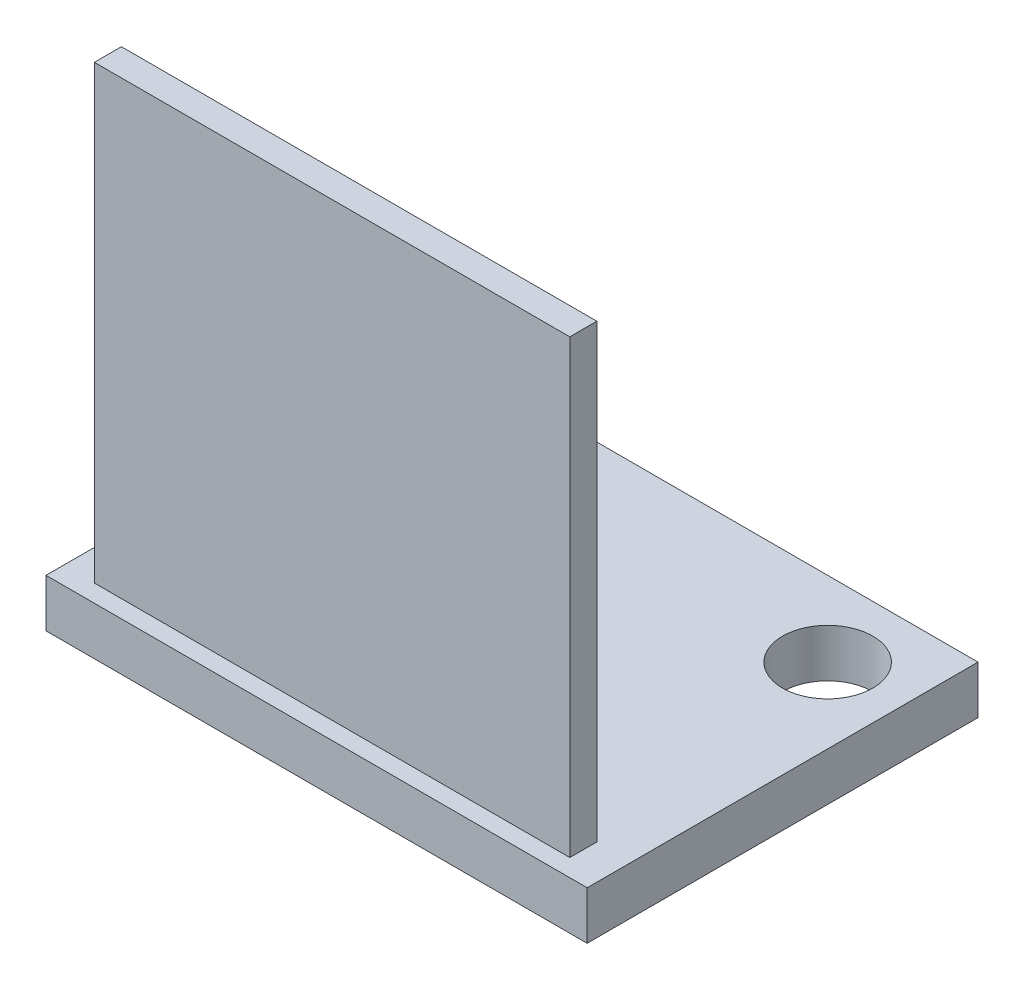
ISO-10303-21;
HEADER;
FILE_DESCRIPTION(('STEP AP214'),'2;1');
FILE_NAME('part.step','',(''),(''),'','','');
FILE_SCHEMA(('AUTOMOTIVE_DESIGN { 1 0 10303 214 1 1 1 1 }'));
ENDSEC;
DATA;
#1=APPLICATION_CONTEXT('core data for automotive mechanical design processes');
#2=APPLICATION_PROTOCOL_DEFINITION('international standard','automotive_design',2000,#1);
#3=PRODUCT_CONTEXT('',#1,'mechanical');
#4=PRODUCT('Part','Part','',(#3));
#5=PRODUCT_RELATED_PRODUCT_CATEGORY('part','',(#4));
#6=PRODUCT_DEFINITION_FORMATION('','',#4);
#7=PRODUCT_DEFINITION_CONTEXT('part definition',#1,'design');
#8=PRODUCT_DEFINITION('design','',#6,#7);
#9=PRODUCT_DEFINITION_SHAPE('','',#8);
#10=(LENGTH_UNIT() NAMED_UNIT(*) SI_UNIT(.MILLI.,.METRE.));
#11=(NAMED_UNIT(*) PLANE_ANGLE_UNIT() SI_UNIT($,.RADIAN.));
#12=(NAMED_UNIT(*) SI_UNIT($,.STERADIAN.) SOLID_ANGLE_UNIT());
#13=UNCERTAINTY_MEASURE_WITH_UNIT(LENGTH_MEASURE(1.E-05),#10,'distance_accuracy_value','');
#14=(GEOMETRIC_REPRESENTATION_CONTEXT(3) GLOBAL_UNCERTAINTY_ASSIGNED_CONTEXT((#13)) GLOBAL_UNIT_ASSIGNED_CONTEXT((#10,
#11,#12)) REPRESENTATION_CONTEXT('',''));
#15=CARTESIAN_POINT('',(0.,0.,0.));
#16=DIRECTION('',(0.,0.,1.));
#17=DIRECTION('',(1.,0.,0.));
#18=AXIS2_PLACEMENT_3D('',#15,#16,#17);
#19=CARTESIAN_POINT('',(0.,1.6,0.));
#20=DIRECTION('',(0.,1.,0.));
#21=DIRECTION('',(0.,0.,1.));
#22=AXIS2_PLACEMENT_3D('',#19,#20,#21);
#23=PLANE('',#22);
#24=CARTESIAN_POINT('',(2.5,1.6,2.5));
#25=DIRECTION('',(0.,1.,0.));
#26=DIRECTION('',(0.,0.,1.));
#27=AXIS2_PLACEMENT_3D('',#24,#25,#26);
#28=CIRCLE('',#27,1.5);
#29=CARTESIAN_POINT('',(2.5,1.6,4.));
#30=VERTEX_POINT('',#29);
#31=EDGE_CURVE('E190',#30,#30,#28,.T.);
#32=ORIENTED_EDGE('',*,*,#31,.F.);
#33=EDGE_LOOP('',(#32));
#34=FACE_BOUND('',#33,.T.);
#35=DIRECTION('',(0.,0.,1.));
#36=VECTOR('',#35,1.);
#37=CARTESIAN_POINT('',(0.,1.6,0.));
#38=LINE('',#37,#36);
#39=CARTESIAN_POINT('',(0.,1.6,0.));
#40=VERTEX_POINT('',#39);
#41=CARTESIAN_POINT('',(0.,1.6,13.));
#42=VERTEX_POINT('',#41);
#43=EDGE_CURVE('E196',#40,#42,#38,.T.);
#44=ORIENTED_EDGE('',*,*,#43,.T.);
#45=DIRECTION('',(1.,0.,0.));
#46=VECTOR('',#45,1.);
#47=CARTESIAN_POINT('',(0.,1.6,13.));
#48=LINE('',#47,#46);
#49=CARTESIAN_POINT('',(18.,1.6,13.));
#50=VERTEX_POINT('',#49);
#51=EDGE_CURVE('E199',#42,#50,#48,.T.);
#52=ORIENTED_EDGE('',*,*,#51,.T.);
#53=DIRECTION('',(0.,0.,-1.));
#54=VECTOR('',#53,1.);
#55=CARTESIAN_POINT('',(18.,1.6,0.));
#56=LINE('',#55,#54);
#57=CARTESIAN_POINT('',(18.,1.6,0.));
#58=VERTEX_POINT('',#57);
#59=EDGE_CURVE('E202',#50,#58,#56,.T.);
#60=ORIENTED_EDGE('',*,*,#59,.T.);
#61=DIRECTION('',(-1.,0.,0.));
#62=VECTOR('',#61,1.);
#63=CARTESIAN_POINT('',(0.,1.6,0.));
#64=LINE('',#63,#62);
#65=EDGE_CURVE('E204',#58,#40,#64,.T.);
#66=ORIENTED_EDGE('',*,*,#65,.T.);
#67=EDGE_LOOP('',(#44,#52,#60,#66));
#68=FACE_BOUND('',#67,.T.);
#69=CARTESIAN_POINT('',(15.5,1.6,2.5));
#70=DIRECTION('',(0.,1.,0.));
#71=DIRECTION('',(0.,0.,1.));
#72=AXIS2_PLACEMENT_3D('',#69,#70,#71);
#73=CIRCLE('',#72,1.5);
#74=CARTESIAN_POINT('',(15.5,1.6,3.99999999999999));
#75=VERTEX_POINT('',#74);
#76=EDGE_CURVE('E184',#75,#75,#73,.T.);
#77=ORIENTED_EDGE('',*,*,#76,.F.);
#78=EDGE_LOOP('',(#77));
#79=FACE_BOUND('',#78,.T.);
#80=DIRECTION('',(1.,0.,0.));
#81=VECTOR('',#80,1.);
#82=CARTESIAN_POINT('',(1.02633327182702,1.6,12.4178257241451));
#83=LINE('',#82,#81);
#84=CARTESIAN_POINT('',(1.02633327182702,1.6,12.4178257241451));
#85=VERTEX_POINT('',#84);
#86=CARTESIAN_POINT('',(16.8404948412724,1.6,12.4178257241451));
#87=VERTEX_POINT('',#86);
#88=EDGE_CURVE('E413',#85,#87,#83,.T.);
#89=ORIENTED_EDGE('',*,*,#88,.F.);
#90=DIRECTION('',(0.,0.,1.));
#91=VECTOR('',#90,1.);
#92=CARTESIAN_POINT('',(1.02633327182702,1.6,11.5189154875661));
#93=LINE('',#92,#91);
#94=CARTESIAN_POINT('',(1.02633327182702,1.6,11.5189154875661));
#95=VERTEX_POINT('',#94);
#96=EDGE_CURVE('E147',#95,#85,#93,.T.);
#97=ORIENTED_EDGE('',*,*,#96,.F.);
#98=DIRECTION('',(-1.,0.,0.));
#99=VECTOR('',#98,1.);
#100=CARTESIAN_POINT('',(1.02633327182702,1.6,11.5189154875661));
#101=LINE('',#100,#99);
#102=CARTESIAN_POINT('',(16.8404948412724,1.6,11.5189154875661));
#103=VERTEX_POINT('',#102);
#104=EDGE_CURVE('E143',#103,#95,#101,.T.);
#105=ORIENTED_EDGE('',*,*,#104,.F.);
#106=DIRECTION('',(0.,0.,-1.));
#107=VECTOR('',#106,1.);
#108=CARTESIAN_POINT('',(16.8404948412724,1.6,11.5189154875661));
#109=LINE('',#108,#107);
#110=EDGE_CURVE('E410',#87,#103,#109,.T.);
#111=ORIENTED_EDGE('',*,*,#110,.F.);
#112=EDGE_LOOP('',(#89,#97,#105,#111));
#113=FACE_BOUND('',#112,.T.);
#114=ADVANCED_FACE('F35',(#34,#68,#79,#113),#23,.T.);
#115=CARTESIAN_POINT('',(0.,0.,0.));
#116=DIRECTION('',(0.,1.,0.));
#117=DIRECTION('',(0.,0.,1.));
#118=AXIS2_PLACEMENT_3D('',#115,#116,#117);
#119=PLANE('',#118);
#120=CARTESIAN_POINT('',(15.5,0.,2.5));
#121=DIRECTION('',(0.,1.,0.));
#122=DIRECTION('',(0.,0.,1.));
#123=AXIS2_PLACEMENT_3D('',#120,#121,#122);
#124=CIRCLE('',#123,1.5);
#125=CARTESIAN_POINT('',(15.5,0.,3.99999999999999));
#126=VERTEX_POINT('',#125);
#127=EDGE_CURVE('E183',#126,#126,#124,.T.);
#128=ORIENTED_EDGE('',*,*,#127,.T.);
#129=EDGE_LOOP('',(#128));
#130=FACE_BOUND('',#129,.T.);
#131=CARTESIAN_POINT('',(2.5,0.,2.5));
#132=DIRECTION('',(0.,1.,0.));
#133=DIRECTION('',(0.,0.,1.));
#134=AXIS2_PLACEMENT_3D('',#131,#132,#133);
#135=CIRCLE('',#134,1.5);
#136=CARTESIAN_POINT('',(2.5,0.,4.));
#137=VERTEX_POINT('',#136);
#138=EDGE_CURVE('E187',#137,#137,#135,.T.);
#139=ORIENTED_EDGE('',*,*,#138,.T.);
#140=EDGE_LOOP('',(#139));
#141=FACE_BOUND('',#140,.T.);
#142=DIRECTION('',(0.,0.,1.));
#143=VECTOR('',#142,1.);
#144=CARTESIAN_POINT('',(0.,0.,0.));
#145=LINE('',#144,#143);
#146=CARTESIAN_POINT('',(0.,0.,0.));
#147=VERTEX_POINT('',#146);
#148=CARTESIAN_POINT('',(0.,0.,13.));
#149=VERTEX_POINT('',#148);
#150=EDGE_CURVE('E193',#147,#149,#145,.T.);
#151=ORIENTED_EDGE('',*,*,#150,.F.);
#152=DIRECTION('',(-1.,0.,0.));
#153=VECTOR('',#152,1.);
#154=CARTESIAN_POINT('',(0.,0.,0.));
#155=LINE('',#154,#153);
#156=CARTESIAN_POINT('',(18.,0.,0.));
#157=VERTEX_POINT('',#156);
#158=EDGE_CURVE('E200',#157,#147,#155,.T.);
#159=ORIENTED_EDGE('',*,*,#158,.F.);
#160=DIRECTION('',(0.,0.,-1.));
#161=VECTOR('',#160,1.);
#162=CARTESIAN_POINT('',(18.,0.,0.));
#163=LINE('',#162,#161);
#164=CARTESIAN_POINT('',(18.,0.,13.));
#165=VERTEX_POINT('',#164);
#166=EDGE_CURVE('E211',#165,#157,#163,.T.);
#167=ORIENTED_EDGE('',*,*,#166,.F.);
#168=DIRECTION('',(1.,0.,0.));
#169=VECTOR('',#168,1.);
#170=CARTESIAN_POINT('',(0.,0.,13.));
#171=LINE('',#170,#169);
#172=EDGE_CURVE('E209',#149,#165,#171,.T.);
#173=ORIENTED_EDGE('',*,*,#172,.F.);
#174=EDGE_LOOP('',(#151,#159,#167,#173));
#175=FACE_BOUND('',#174,.T.);
#176=DIRECTION('',(0.,0.,-1.));
#177=VECTOR('',#176,1.);
#178=CARTESIAN_POINT('',(1.5,0.,12.));
#179=LINE('',#178,#177);
#180=CARTESIAN_POINT('',(1.5,0.,12.));
#181=VERTEX_POINT('',#180);
#182=CARTESIAN_POINT('',(1.5,0.,10.5));
#183=VERTEX_POINT('',#182);
#184=EDGE_CURVE('E149',#181,#183,#179,.T.);
#185=ORIENTED_EDGE('',*,*,#184,.F.);
#186=DIRECTION('',(-1.,0.,0.));
#187=VECTOR('',#186,1.);
#188=CARTESIAN_POINT('',(1.5,0.,12.));
#189=LINE('',#188,#187);
#190=CARTESIAN_POINT('',(16.5,0.,12.));
#191=VERTEX_POINT('',#190);
#192=EDGE_CURVE('E160',#191,#181,#189,.T.);
#193=ORIENTED_EDGE('',*,*,#192,.F.);
#194=DIRECTION('',(0.,0.,1.));
#195=VECTOR('',#194,1.);
#196=CARTESIAN_POINT('',(16.5,0.,12.));
#197=LINE('',#196,#195);
#198=CARTESIAN_POINT('',(16.5,0.,10.5));
#199=VERTEX_POINT('',#198);
#200=EDGE_CURVE('E168',#199,#191,#197,.T.);
#201=ORIENTED_EDGE('',*,*,#200,.F.);
#202=DIRECTION('',(1.,0.,0.));
#203=VECTOR('',#202,1.);
#204=CARTESIAN_POINT('',(1.5,0.,10.5));
#205=LINE('',#204,#203);
#206=EDGE_CURVE('E58',#183,#199,#205,.T.);
#207=ORIENTED_EDGE('',*,*,#206,.F.);
#208=EDGE_LOOP('',(#185,#193,#201,#207));
#209=FACE_BOUND('',#208,.T.);
#210=ADVANCED_FACE('F229',(#130,#141,#175,#209),#119,.F.);
#211=CARTESIAN_POINT('',(0.,1.6,0.));
#212=DIRECTION('',(1.,0.,0.));
#213=DIRECTION('',(0.,0.,-1.));
#214=AXIS2_PLACEMENT_3D('',#211,#212,#213);
#215=PLANE('',#214);
#216=ORIENTED_EDGE('',*,*,#150,.T.);
#217=DIRECTION('',(0.,-1.,0.));
#218=VECTOR('',#217,1.);
#219=CARTESIAN_POINT('',(0.,1.6,13.));
#220=LINE('',#219,#218);
#221=EDGE_CURVE('E11',#42,#149,#220,.T.);
#222=ORIENTED_EDGE('',*,*,#221,.F.);
#223=ORIENTED_EDGE('',*,*,#43,.F.);
#224=DIRECTION('',(0.,-1.,0.));
#225=VECTOR('',#224,1.);
#226=CARTESIAN_POINT('',(0.,1.6,0.));
#227=LINE('',#226,#225);
#228=EDGE_CURVE('E206',#40,#147,#227,.T.);
#229=ORIENTED_EDGE('',*,*,#228,.T.);
#230=EDGE_LOOP('',(#216,#222,#223,#229));
#231=FACE_BOUND('',#230,.T.);
#232=ADVANCED_FACE('F37',(#231),#215,.F.);
#233=CARTESIAN_POINT('',(0.,1.6,13.));
#234=DIRECTION('',(0.,0.,-1.));
#235=DIRECTION('',(-1.,0.,0.));
#236=AXIS2_PLACEMENT_3D('',#233,#234,#235);
#237=PLANE('',#236);
#238=ORIENTED_EDGE('',*,*,#172,.T.);
#239=DIRECTION('',(0.,-1.,0.));
#240=VECTOR('',#239,1.);
#241=CARTESIAN_POINT('',(18.,1.6,13.));
#242=LINE('',#241,#240);
#243=EDGE_CURVE('E43',#50,#165,#242,.T.);
#244=ORIENTED_EDGE('',*,*,#243,.F.);
#245=ORIENTED_EDGE('',*,*,#51,.F.);
#246=ORIENTED_EDGE('',*,*,#221,.T.);
#247=EDGE_LOOP('',(#238,#244,#245,#246));
#248=FACE_BOUND('',#247,.T.);
#249=ADVANCED_FACE('F239',(#248),#237,.F.);
#250=CARTESIAN_POINT('',(18.,1.6,0.));
#251=DIRECTION('',(-1.,0.,0.));
#252=DIRECTION('',(0.,0.,1.));
#253=AXIS2_PLACEMENT_3D('',#250,#251,#252);
#254=PLANE('',#253);
#255=ORIENTED_EDGE('',*,*,#166,.T.);
#256=DIRECTION('',(0.,-1.,0.));
#257=VECTOR('',#256,1.);
#258=CARTESIAN_POINT('',(18.,1.6,0.));
#259=LINE('',#258,#257);
#260=EDGE_CURVE('E216',#58,#157,#259,.T.);
#261=ORIENTED_EDGE('',*,*,#260,.F.);
#262=ORIENTED_EDGE('',*,*,#59,.F.);
#263=ORIENTED_EDGE('',*,*,#243,.T.);
#264=EDGE_LOOP('',(#255,#261,#262,#263));
#265=FACE_BOUND('',#264,.T.);
#266=ADVANCED_FACE('F223',(#265),#254,.F.);
#267=CARTESIAN_POINT('',(0.,1.6,0.));
#268=DIRECTION('',(0.,0.,1.));
#269=DIRECTION('',(1.,0.,0.));
#270=AXIS2_PLACEMENT_3D('',#267,#268,#269);
#271=PLANE('',#270);
#272=ORIENTED_EDGE('',*,*,#158,.T.);
#273=ORIENTED_EDGE('',*,*,#228,.F.);
#274=ORIENTED_EDGE('',*,*,#65,.F.);
#275=ORIENTED_EDGE('',*,*,#260,.T.);
#276=EDGE_LOOP('',(#272,#273,#274,#275));
#277=FACE_BOUND('',#276,.T.);
#278=ADVANCED_FACE('F232',(#277),#271,.F.);
#279=CARTESIAN_POINT('',(2.5,1.6,2.5));
#280=DIRECTION('',(0.,-1.,0.));
#281=DIRECTION('',(0.,0.,-1.));
#282=AXIS2_PLACEMENT_3D('',#279,#280,#281);
#283=CYLINDRICAL_SURFACE('',#282,1.5);
#284=ORIENTED_EDGE('',*,*,#31,.T.);
#285=EDGE_LOOP('',(#284));
#286=FACE_BOUND('',#285,.T.);
#287=ORIENTED_EDGE('',*,*,#138,.F.);
#288=EDGE_LOOP('',(#287));
#289=FACE_BOUND('',#288,.T.);
#290=ADVANCED_FACE('F258',(#286,#289),#283,.F.);
#291=CARTESIAN_POINT('',(15.5,1.6,2.5));
#292=DIRECTION('',(0.,-1.,0.));
#293=DIRECTION('',(0.,0.,-1.));
#294=AXIS2_PLACEMENT_3D('',#291,#292,#293);
#295=CYLINDRICAL_SURFACE('',#294,1.5);
#296=ORIENTED_EDGE('',*,*,#76,.T.);
#297=EDGE_LOOP('',(#296));
#298=FACE_BOUND('',#297,.T.);
#299=ORIENTED_EDGE('',*,*,#127,.F.);
#300=EDGE_LOOP('',(#299));
#301=FACE_BOUND('',#300,.T.);
#302=ADVANCED_FACE('F265',(#298,#301),#295,.F.);
#303=CARTESIAN_POINT('',(1.5,-1.,12.));
#304=DIRECTION('',(1.,0.,0.));
#305=DIRECTION('',(0.,0.,-1.));
#306=AXIS2_PLACEMENT_3D('',#303,#304,#305);
#307=PLANE('',#306);
#308=ORIENTED_EDGE('',*,*,#184,.T.);
#309=DIRECTION('',(0.,1.,0.));
#310=VECTOR('',#309,1.);
#311=CARTESIAN_POINT('',(1.5,-1.,10.5));
#312=LINE('',#311,#310);
#313=CARTESIAN_POINT('',(1.5,-1.,10.5));
#314=VERTEX_POINT('',#313);
#315=EDGE_CURVE('E181',#314,#183,#312,.T.);
#316=ORIENTED_EDGE('',*,*,#315,.F.);
#317=DIRECTION('',(0.,0.,-1.));
#318=VECTOR('',#317,1.);
#319=CARTESIAN_POINT('',(1.5,-1.,12.));
#320=LINE('',#319,#318);
#321=CARTESIAN_POINT('',(1.5,-1.,12.));
#322=VERTEX_POINT('',#321);
#323=EDGE_CURVE('E156',#322,#314,#320,.T.);
#324=ORIENTED_EDGE('',*,*,#323,.F.);
#325=DIRECTION('',(0.,1.,0.));
#326=VECTOR('',#325,1.);
#327=CARTESIAN_POINT('',(1.5,-1.,12.));
#328=LINE('',#327,#326);
#329=EDGE_CURVE('E165',#322,#181,#328,.T.);
#330=ORIENTED_EDGE('',*,*,#329,.T.);
#331=EDGE_LOOP('',(#308,#316,#324,#330));
#332=FACE_BOUND('',#331,.T.);
#333=ADVANCED_FACE('F270',(#332),#307,.F.);
#334=CARTESIAN_POINT('',(1.5,-1.,10.5));
#335=DIRECTION('',(0.,0.,1.));
#336=DIRECTION('',(1.,0.,0.));
#337=AXIS2_PLACEMENT_3D('',#334,#335,#336);
#338=PLANE('',#337);
#339=ORIENTED_EDGE('',*,*,#206,.T.);
#340=DIRECTION('',(0.,1.,0.));
#341=VECTOR('',#340,1.);
#342=CARTESIAN_POINT('',(16.5,-1.,10.5));
#343=LINE('',#342,#341);
#344=CARTESIAN_POINT('',(16.5,-1.,10.5));
#345=VERTEX_POINT('',#344);
#346=EDGE_CURVE('E178',#345,#199,#343,.T.);
#347=ORIENTED_EDGE('',*,*,#346,.F.);
#348=DIRECTION('',(1.,0.,0.));
#349=VECTOR('',#348,1.);
#350=CARTESIAN_POINT('',(1.5,-1.,10.5));
#351=LINE('',#350,#349);
#352=EDGE_CURVE('E159',#314,#345,#351,.T.);
#353=ORIENTED_EDGE('',*,*,#352,.F.);
#354=ORIENTED_EDGE('',*,*,#315,.T.);
#355=EDGE_LOOP('',(#339,#347,#353,#354));
#356=FACE_BOUND('',#355,.T.);
#357=ADVANCED_FACE('F279',(#356),#338,.F.);
#358=CARTESIAN_POINT('',(16.5,-1.,12.));
#359=DIRECTION('',(-1.,0.,0.));
#360=DIRECTION('',(0.,0.,1.));
#361=AXIS2_PLACEMENT_3D('',#358,#359,#360);
#362=PLANE('',#361);
#363=ORIENTED_EDGE('',*,*,#200,.T.);
#364=DIRECTION('',(0.,1.,0.));
#365=VECTOR('',#364,1.);
#366=CARTESIAN_POINT('',(16.5,-1.,12.));
#367=LINE('',#366,#365);
#368=CARTESIAN_POINT('',(16.5,-1.,12.));
#369=VERTEX_POINT('',#368);
#370=EDGE_CURVE('E175',#369,#191,#367,.T.);
#371=ORIENTED_EDGE('',*,*,#370,.F.);
#372=DIRECTION('',(0.,0.,1.));
#373=VECTOR('',#372,1.);
#374=CARTESIAN_POINT('',(16.5,-1.,12.));
#375=LINE('',#374,#373);
#376=EDGE_CURVE('E162',#345,#369,#375,.T.);
#377=ORIENTED_EDGE('',*,*,#376,.F.);
#378=ORIENTED_EDGE('',*,*,#346,.T.);
#379=EDGE_LOOP('',(#363,#371,#377,#378));
#380=FACE_BOUND('',#379,.T.);
#381=ADVANCED_FACE('F286',(#380),#362,.F.);
#382=CARTESIAN_POINT('',(1.5,-1.,12.));
#383=DIRECTION('',(0.,0.,-1.));
#384=DIRECTION('',(-1.,0.,0.));
#385=AXIS2_PLACEMENT_3D('',#382,#383,#384);
#386=PLANE('',#385);
#387=ORIENTED_EDGE('',*,*,#192,.T.);
#388=ORIENTED_EDGE('',*,*,#329,.F.);
#389=DIRECTION('',(-1.,0.,0.));
#390=VECTOR('',#389,1.);
#391=CARTESIAN_POINT('',(1.5,-1.,12.));
#392=LINE('',#391,#390);
#393=EDGE_CURVE('E164',#369,#322,#392,.T.);
#394=ORIENTED_EDGE('',*,*,#393,.F.);
#395=ORIENTED_EDGE('',*,*,#370,.T.);
#396=EDGE_LOOP('',(#387,#388,#394,#395));
#397=FACE_BOUND('',#396,.T.);
#398=ADVANCED_FACE('F290',(#397),#386,.F.);
#399=CARTESIAN_POINT('',(0.,-1.,0.));
#400=DIRECTION('',(0.,-1.,0.));
#401=DIRECTION('',(0.,0.,-1.));
#402=AXIS2_PLACEMENT_3D('',#399,#400,#401);
#403=PLANE('',#402);
#404=ORIENTED_EDGE('',*,*,#323,.T.);
#405=ORIENTED_EDGE('',*,*,#352,.T.);
#406=ORIENTED_EDGE('',*,*,#376,.T.);
#407=ORIENTED_EDGE('',*,*,#393,.T.);
#408=EDGE_LOOP('',(#404,#405,#406,#407));
#409=FACE_BOUND('',#408,.T.);
#410=ADVANCED_FACE('F294',(#409),#403,.T.);
#411=CARTESIAN_POINT('',(1.02633327182702,16.6,11.5189154875661));
#412=DIRECTION('',(1.,0.,0.));
#413=DIRECTION('',(0.,0.,-1.));
#414=AXIS2_PLACEMENT_3D('',#411,#412,#413);
#415=PLANE('',#414);
#416=ORIENTED_EDGE('',*,*,#96,.T.);
#417=DIRECTION('',(0.,-1.,0.));
#418=VECTOR('',#417,1.);
#419=CARTESIAN_POINT('',(1.02633327182702,16.6,12.4178257241451));
#420=LINE('',#419,#418);
#421=CARTESIAN_POINT('',(1.02633327182702,16.6,12.4178257241451));
#422=VERTEX_POINT('',#421);
#423=EDGE_CURVE('E128',#422,#85,#420,.T.);
#424=ORIENTED_EDGE('',*,*,#423,.F.);
#425=DIRECTION('',(0.,0.,1.));
#426=VECTOR('',#425,1.);
#427=CARTESIAN_POINT('',(1.02633327182702,16.6,11.5189154875661));
#428=LINE('',#427,#426);
#429=CARTESIAN_POINT('',(1.02633327182702,16.6,11.5189154875661));
#430=VERTEX_POINT('',#429);
#431=EDGE_CURVE('E135',#430,#422,#428,.T.);
#432=ORIENTED_EDGE('',*,*,#431,.F.);
#433=DIRECTION('',(0.,-1.,0.));
#434=VECTOR('',#433,1.);
#435=CARTESIAN_POINT('',(1.02633327182702,16.6,11.5189154875661));
#436=LINE('',#435,#434);
#437=EDGE_CURVE('E407',#430,#95,#436,.T.);
#438=ORIENTED_EDGE('',*,*,#437,.T.);
#439=EDGE_LOOP('',(#416,#424,#432,#438));
#440=FACE_BOUND('',#439,.T.);
#441=ADVANCED_FACE('F145',(#440),#415,.F.);
#442=CARTESIAN_POINT('',(1.02633327182702,16.6,12.4178257241451));
#443=DIRECTION('',(0.,0.,-1.));
#444=DIRECTION('',(-1.,0.,0.));
#445=AXIS2_PLACEMENT_3D('',#442,#443,#444);
#446=PLANE('',#445);
#447=ORIENTED_EDGE('',*,*,#88,.T.);
#448=DIRECTION('',(0.,-1.,0.));
#449=VECTOR('',#448,1.);
#450=CARTESIAN_POINT('',(16.8404948412724,16.6,12.4178257241451));
#451=LINE('',#450,#449);
#452=CARTESIAN_POINT('',(16.8404948412724,16.6,12.4178257241451));
#453=VERTEX_POINT('',#452);
#454=EDGE_CURVE('E131',#453,#87,#451,.T.);
#455=ORIENTED_EDGE('',*,*,#454,.F.);
#456=DIRECTION('',(1.,0.,0.));
#457=VECTOR('',#456,1.);
#458=CARTESIAN_POINT('',(1.02633327182702,16.6,12.4178257241451));
#459=LINE('',#458,#457);
#460=EDGE_CURVE('E124',#422,#453,#459,.T.);
#461=ORIENTED_EDGE('',*,*,#460,.F.);
#462=ORIENTED_EDGE('',*,*,#423,.T.);
#463=EDGE_LOOP('',(#447,#455,#461,#462));
#464=FACE_BOUND('',#463,.T.);
#465=ADVANCED_FACE('F126',(#464),#446,.F.);
#466=CARTESIAN_POINT('',(16.8404948412724,16.6,11.5189154875661));
#467=DIRECTION('',(-1.,0.,0.));
#468=DIRECTION('',(0.,0.,1.));
#469=AXIS2_PLACEMENT_3D('',#466,#467,#468);
#470=PLANE('',#469);
#471=ORIENTED_EDGE('',*,*,#110,.T.);
#472=DIRECTION('',(0.,-1.,0.));
#473=VECTOR('',#472,1.);
#474=CARTESIAN_POINT('',(16.8404948412724,16.6,11.5189154875661));
#475=LINE('',#474,#473);
#476=CARTESIAN_POINT('',(16.8404948412724,16.6,11.5189154875661));
#477=VERTEX_POINT('',#476);
#478=EDGE_CURVE('E50',#477,#103,#475,.T.);
#479=ORIENTED_EDGE('',*,*,#478,.F.);
#480=DIRECTION('',(0.,0.,-1.));
#481=VECTOR('',#480,1.);
#482=CARTESIAN_POINT('',(16.8404948412724,16.6,11.5189154875661));
#483=LINE('',#482,#481);
#484=EDGE_CURVE('E134',#453,#477,#483,.T.);
#485=ORIENTED_EDGE('',*,*,#484,.F.);
#486=ORIENTED_EDGE('',*,*,#454,.T.);
#487=EDGE_LOOP('',(#471,#479,#485,#486));
#488=FACE_BOUND('',#487,.T.);
#489=ADVANCED_FACE('F303',(#488),#470,.F.);
#490=CARTESIAN_POINT('',(1.02633327182702,16.6,11.5189154875661));
#491=DIRECTION('',(0.,0.,1.));
#492=DIRECTION('',(1.,0.,0.));
#493=AXIS2_PLACEMENT_3D('',#490,#491,#492);
#494=PLANE('',#493);
#495=ORIENTED_EDGE('',*,*,#104,.T.);
#496=ORIENTED_EDGE('',*,*,#437,.F.);
#497=DIRECTION('',(-1.,0.,0.));
#498=VECTOR('',#497,1.);
#499=CARTESIAN_POINT('',(1.02633327182702,16.6,11.5189154875661));
#500=LINE('',#499,#498);
#501=EDGE_CURVE('E139',#477,#430,#500,.T.);
#502=ORIENTED_EDGE('',*,*,#501,.F.);
#503=ORIENTED_EDGE('',*,*,#478,.T.);
#504=EDGE_LOOP('',(#495,#496,#502,#503));
#505=FACE_BOUND('',#504,.T.);
#506=ADVANCED_FACE('F306',(#505),#494,.F.);
#507=CARTESIAN_POINT('',(0.,16.6,0.));
#508=DIRECTION('',(0.,1.,0.));
#509=DIRECTION('',(0.,0.,1.));
#510=AXIS2_PLACEMENT_3D('',#507,#508,#509);
#511=PLANE('',#510);
#512=ORIENTED_EDGE('',*,*,#431,.T.);
#513=ORIENTED_EDGE('',*,*,#460,.T.);
#514=ORIENTED_EDGE('',*,*,#484,.T.);
#515=ORIENTED_EDGE('',*,*,#501,.T.);
#516=EDGE_LOOP('',(#512,#513,#514,#515));
#517=FACE_BOUND('',#516,.T.);
#518=ADVANCED_FACE('F138',(#517),#511,.T.);
#519=CLOSED_SHELL('',(#114,#210,#232,#249,#266,#278,#290,#302,#333,#357,#381,#398,#410,#441,
#465,#489,#506,#518));
#520=MANIFOLD_SOLID_BREP('B2',#519);
#521=ADVANCED_BREP_SHAPE_REPRESENTATION('',(#18,#520),#14);
#522=SHAPE_DEFINITION_REPRESENTATION(#9,#521);
ENDSEC;
END-ISO-10303-21;
